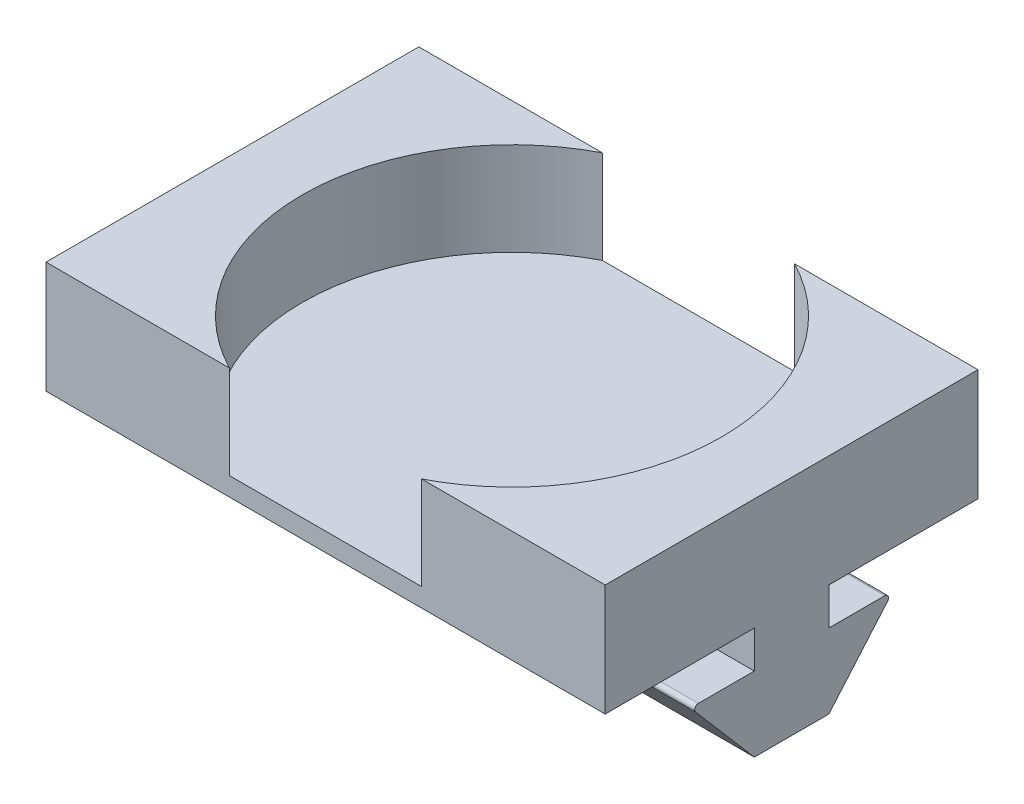
ISO-10303-21;
HEADER;
FILE_DESCRIPTION(('STEP AP214'),'2;1');
FILE_NAME('part.step','',(''),(''),'','','');
FILE_SCHEMA(('AUTOMOTIVE_DESIGN { 1 0 10303 214 1 1 1 1 }'));
ENDSEC;
DATA;
#1=APPLICATION_CONTEXT('core data for automotive mechanical design processes');
#2=APPLICATION_PROTOCOL_DEFINITION('international standard','automotive_design',2000,#1);
#3=PRODUCT_CONTEXT('',#1,'mechanical');
#4=PRODUCT('Part','Part','',(#3));
#5=PRODUCT_RELATED_PRODUCT_CATEGORY('part','',(#4));
#6=PRODUCT_DEFINITION_FORMATION('','',#4);
#7=PRODUCT_DEFINITION_CONTEXT('part definition',#1,'design');
#8=PRODUCT_DEFINITION('design','',#6,#7);
#9=PRODUCT_DEFINITION_SHAPE('','',#8);
#10=(LENGTH_UNIT() NAMED_UNIT(*) SI_UNIT(.MILLI.,.METRE.));
#11=(NAMED_UNIT(*) PLANE_ANGLE_UNIT() SI_UNIT($,.RADIAN.));
#12=(NAMED_UNIT(*) SI_UNIT($,.STERADIAN.) SOLID_ANGLE_UNIT());
#13=UNCERTAINTY_MEASURE_WITH_UNIT(LENGTH_MEASURE(1.E-05),#10,'distance_accuracy_value','');
#14=(GEOMETRIC_REPRESENTATION_CONTEXT(3) GLOBAL_UNCERTAINTY_ASSIGNED_CONTEXT((#13)) GLOBAL_UNIT_ASSIGNED_CONTEXT((#10,
#11,#12)) REPRESENTATION_CONTEXT('',''));
#15=CARTESIAN_POINT('',(0.,0.,0.));
#16=DIRECTION('',(0.,0.,1.));
#17=DIRECTION('',(1.,0.,0.));
#18=AXIS2_PLACEMENT_3D('',#15,#16,#17);
#19=CARTESIAN_POINT('',(0.,20.32,0.));
#20=DIRECTION('',(0.,1.,0.));
#21=DIRECTION('',(0.,0.,1.));
#22=AXIS2_PLACEMENT_3D('',#19,#20,#21);
#23=PLANE('',#22);
#24=CARTESIAN_POINT('',(-19.05,20.32,0.));
#25=DIRECTION('',(0.,1.,0.));
#26=DIRECTION('',(0.,0.,1.));
#27=AXIS2_PLACEMENT_3D('',#24,#25,#26);
#28=CIRCLE('',#27,14.2875);
#29=CARTESIAN_POINT('',(-12.504569819332,20.32,12.7));
#30=VERTEX_POINT('',#29);
#31=CARTESIAN_POINT('',(-12.504569819332,20.32,-12.7));
#32=VERTEX_POINT('',#31);
#33=EDGE_CURVE('E393',#30,#32,#28,.T.);
#34=ORIENTED_EDGE('',*,*,#33,.F.);
#35=DIRECTION('',(1.,0.,0.));
#36=VECTOR('',#35,1.);
#37=CARTESIAN_POINT('',(-38.1,20.32,12.7));
#38=LINE('',#37,#36);
#39=CARTESIAN_POINT('',(0.,20.32,12.7));
#40=VERTEX_POINT('',#39);
#41=EDGE_CURVE('E257',#30,#40,#38,.T.);
#42=ORIENTED_EDGE('',*,*,#41,.T.);
#43=DIRECTION('',(0.,0.,-1.));
#44=VECTOR('',#43,1.);
#45=CARTESIAN_POINT('',(0.,20.32,12.7));
#46=LINE('',#45,#44);
#47=CARTESIAN_POINT('',(0.,20.32,-12.7));
#48=VERTEX_POINT('',#47);
#49=EDGE_CURVE('E256',#40,#48,#46,.T.);
#50=ORIENTED_EDGE('',*,*,#49,.T.);
#51=DIRECTION('',(-1.,0.,0.));
#52=VECTOR('',#51,1.);
#53=CARTESIAN_POINT('',(-38.1,20.32,-12.7));
#54=LINE('',#53,#52);
#55=EDGE_CURVE('E400',#48,#32,#54,.T.);
#56=ORIENTED_EDGE('',*,*,#55,.T.);
#57=EDGE_LOOP('',(#34,#42,#50,#56));
#58=FACE_BOUND('',#57,.T.);
#59=ADVANCED_FACE('F43',(#58),#23,.T.);
#60=CARTESIAN_POINT('',(-38.1,0.,2.54));
#61=DIRECTION('',(0.,0.,1.));
#62=DIRECTION('',(1.,0.,0.));
#63=AXIS2_PLACEMENT_3D('',#60,#61,#62);
#64=PLANE('',#63);
#65=DIRECTION('',(0.,-1.,0.));
#66=VECTOR('',#65,1.);
#67=CARTESIAN_POINT('',(0.,0.,2.54));
#68=LINE('',#67,#66);
#69=CARTESIAN_POINT('',(0.,12.7,2.54));
#70=VERTEX_POINT('',#69);
#71=CARTESIAN_POINT('',(0.,10.16,2.54));
#72=VERTEX_POINT('',#71);
#73=EDGE_CURVE('E167',#70,#72,#68,.T.);
#74=ORIENTED_EDGE('',*,*,#73,.F.);
#75=DIRECTION('',(1.,0.,0.));
#76=VECTOR('',#75,1.);
#77=CARTESIAN_POINT('',(-38.1,12.7,2.54));
#78=LINE('',#77,#76);
#79=CARTESIAN_POINT('',(-38.1,12.7,2.54));
#80=VERTEX_POINT('',#79);
#81=EDGE_CURVE('E68',#80,#70,#78,.T.);
#82=ORIENTED_EDGE('',*,*,#81,.F.);
#83=DIRECTION('',(0.,-1.,0.));
#84=VECTOR('',#83,1.);
#85=CARTESIAN_POINT('',(-38.1,0.,2.54));
#86=LINE('',#85,#84);
#87=CARTESIAN_POINT('',(-38.1,10.16,2.54));
#88=VERTEX_POINT('',#87);
#89=EDGE_CURVE('E199',#80,#88,#86,.T.);
#90=ORIENTED_EDGE('',*,*,#89,.T.);
#91=DIRECTION('',(1.,0.,0.));
#92=VECTOR('',#91,1.);
#93=CARTESIAN_POINT('',(-38.1,10.16,2.54));
#94=LINE('',#93,#92);
#95=EDGE_CURVE('E113',#88,#72,#94,.T.);
#96=ORIENTED_EDGE('',*,*,#95,.T.);
#97=EDGE_LOOP('',(#74,#82,#90,#96));
#98=FACE_BOUND('',#97,.T.);
#99=ADVANCED_FACE('F45',(#98),#64,.T.);
#100=CARTESIAN_POINT('',(-38.1,0.,-2.54000000000001));
#101=DIRECTION('',(0.,0.,-1.));
#102=DIRECTION('',(0.,1.,0.));
#103=AXIS2_PLACEMENT_3D('',#100,#101,#102);
#104=PLANE('',#103);
#105=DIRECTION('',(0.,1.,0.));
#106=VECTOR('',#105,1.);
#107=CARTESIAN_POINT('',(0.,0.,-2.54000000000001));
#108=LINE('',#107,#106);
#109=CARTESIAN_POINT('',(0.,10.16,-2.54));
#110=VERTEX_POINT('',#109);
#111=CARTESIAN_POINT('',(0.,12.7,-2.54));
#112=VERTEX_POINT('',#111);
#113=EDGE_CURVE('E139',#110,#112,#108,.T.);
#114=ORIENTED_EDGE('',*,*,#113,.F.);
#115=DIRECTION('',(1.,0.,0.));
#116=VECTOR('',#115,1.);
#117=CARTESIAN_POINT('',(-38.1,10.16,-2.54));
#118=LINE('',#117,#116);
#119=CARTESIAN_POINT('',(-38.1,10.16,-2.54));
#120=VERTEX_POINT('',#119);
#121=EDGE_CURVE('E135',#120,#110,#118,.T.);
#122=ORIENTED_EDGE('',*,*,#121,.F.);
#123=DIRECTION('',(0.,1.,0.));
#124=VECTOR('',#123,1.);
#125=CARTESIAN_POINT('',(-38.1,0.,-2.54000000000001));
#126=LINE('',#125,#124);
#127=CARTESIAN_POINT('',(-38.1,12.7,-2.54));
#128=VERTEX_POINT('',#127);
#129=EDGE_CURVE('E138',#120,#128,#126,.T.);
#130=ORIENTED_EDGE('',*,*,#129,.T.);
#131=DIRECTION('',(1.,0.,0.));
#132=VECTOR('',#131,1.);
#133=CARTESIAN_POINT('',(-38.1,12.7,-2.54));
#134=LINE('',#133,#132);
#135=EDGE_CURVE('E105',#128,#112,#134,.T.);
#136=ORIENTED_EDGE('',*,*,#135,.T.);
#137=EDGE_LOOP('',(#114,#122,#130,#136));
#138=FACE_BOUND('',#137,.T.);
#139=ADVANCED_FACE('F137',(#138),#104,.T.);
#140=CARTESIAN_POINT('',(-38.1,10.16,0.));
#141=DIRECTION('',(0.,1.,0.));
#142=DIRECTION('',(0.,0.,1.));
#143=AXIS2_PLACEMENT_3D('',#140,#141,#142);
#144=PLANE('',#143);
#145=DIRECTION('',(0.,0.,1.));
#146=VECTOR('',#145,1.);
#147=CARTESIAN_POINT('',(0.,10.16,0.));
#148=LINE('',#147,#146);
#149=CARTESIAN_POINT('',(0.,10.16,-6.35));
#150=VERTEX_POINT('',#149);
#151=EDGE_CURVE('E194',#150,#110,#148,.T.);
#152=ORIENTED_EDGE('',*,*,#151,.F.);
#153=DIRECTION('',(1.,0.,0.));
#154=VECTOR('',#153,1.);
#155=CARTESIAN_POINT('',(-38.1,10.16,-6.35));
#156=LINE('',#155,#154);
#157=CARTESIAN_POINT('',(-38.1,10.16,-6.35));
#158=VERTEX_POINT('',#157);
#159=EDGE_CURVE('E145',#158,#150,#156,.T.);
#160=ORIENTED_EDGE('',*,*,#159,.F.);
#161=DIRECTION('',(0.,0.,1.));
#162=VECTOR('',#161,1.);
#163=CARTESIAN_POINT('',(-38.1,10.16,0.));
#164=LINE('',#163,#162);
#165=EDGE_CURVE('E151',#158,#120,#164,.T.);
#166=ORIENTED_EDGE('',*,*,#165,.T.);
#167=ORIENTED_EDGE('',*,*,#121,.T.);
#168=EDGE_LOOP('',(#152,#160,#166,#167));
#169=FACE_BOUND('',#168,.T.);
#170=ADVANCED_FACE('F157',(#169),#144,.T.);
#171=CARTESIAN_POINT('',(-38.1,9.906,-6.35));
#172=DIRECTION('',(1.,0.,0.));
#173=DIRECTION('',(0.,0.,-1.));
#174=AXIS2_PLACEMENT_3D('',#171,#172,#173);
#175=CYLINDRICAL_SURFACE('',#174,0.254000000000001);
#176=CARTESIAN_POINT('',(0.,9.906,-6.35));
#177=DIRECTION('',(1.,0.,0.));
#178=DIRECTION('',(0.,0.,-1.));
#179=AXIS2_PLACEMENT_3D('',#176,#177,#178);
#180=CIRCLE('',#179,0.254000000000001);
#181=CARTESIAN_POINT('',(0.,9.74050920467056,-6.54268834075063));
#182=VERTEX_POINT('',#181);
#183=EDGE_CURVE('E191',#150,#182,#180,.F.);
#184=ORIENTED_EDGE('',*,*,#183,.T.);
#185=DIRECTION('',(1.,0.,0.));
#186=VECTOR('',#185,1.);
#187=CARTESIAN_POINT('',(-38.1,9.74050920467056,-6.54268834075063));
#188=LINE('',#187,#186);
#189=CARTESIAN_POINT('',(-38.1,9.74050920467056,-6.54268834075063));
#190=VERTEX_POINT('',#189);
#191=EDGE_CURVE('E206',#190,#182,#188,.T.);
#192=ORIENTED_EDGE('',*,*,#191,.F.);
#193=CARTESIAN_POINT('',(-38.1,9.906,-6.35));
#194=DIRECTION('',(1.,0.,0.));
#195=DIRECTION('',(0.,0.,-1.));
#196=AXIS2_PLACEMENT_3D('',#193,#194,#195);
#197=CIRCLE('',#196,0.254000000000001);
#198=EDGE_CURVE('E160',#158,#190,#197,.F.);
#199=ORIENTED_EDGE('',*,*,#198,.F.);
#200=ORIENTED_EDGE('',*,*,#159,.T.);
#201=EDGE_LOOP('',(#184,#192,#199,#200));
#202=FACE_BOUND('',#201,.T.);
#203=ADVANCED_FACE('F556',(#202),#175,.T.);
#204=CARTESIAN_POINT('',(-38.1,0.90103385496104,1.04911404967848));
#205=DIRECTION('',(0.,0.651538564289137,0.758615514766241));
#206=DIRECTION('',(0.,-0.758615514766242,0.651538564289137));
#207=AXIS2_PLACEMENT_3D('',#204,#205,#206);
#208=PLANE('',#207);
#209=DIRECTION('',(0.,-0.758615514766242,0.651538564289137));
#210=VECTOR('',#209,1.);
#211=CARTESIAN_POINT('',(0.,0.90103385496104,1.04911404967848));
#212=LINE('',#211,#210);
#213=CARTESIAN_POINT('',(0.,5.08,-2.54));
#214=VERTEX_POINT('',#213);
#215=EDGE_CURVE('E188',#182,#214,#212,.T.);
#216=ORIENTED_EDGE('',*,*,#215,.T.);
#217=DIRECTION('',(1.,0.,0.));
#218=VECTOR('',#217,1.);
#219=CARTESIAN_POINT('',(-38.1,5.08,-2.54));
#220=LINE('',#219,#218);
#221=CARTESIAN_POINT('',(-38.1,5.08,-2.54));
#222=VERTEX_POINT('',#221);
#223=EDGE_CURVE('E210',#222,#214,#220,.T.);
#224=ORIENTED_EDGE('',*,*,#223,.F.);
#225=DIRECTION('',(0.,-0.758615514766242,0.651538564289137));
#226=VECTOR('',#225,1.);
#227=CARTESIAN_POINT('',(-38.1,0.90103385496104,1.04911404967848));
#228=LINE('',#227,#226);
#229=EDGE_CURVE('E163',#190,#222,#228,.T.);
#230=ORIENTED_EDGE('',*,*,#229,.F.);
#231=ORIENTED_EDGE('',*,*,#191,.T.);
#232=EDGE_LOOP('',(#216,#224,#230,#231));
#233=FACE_BOUND('',#232,.T.);
#234=ADVANCED_FACE('F321',(#233),#208,.F.);
#235=CARTESIAN_POINT('',(-38.1,5.08,0.));
#236=DIRECTION('',(0.,1.,0.));
#237=DIRECTION('',(0.,0.,1.));
#238=AXIS2_PLACEMENT_3D('',#235,#236,#237);
#239=PLANE('',#238);
#240=DIRECTION('',(0.,0.,1.));
#241=VECTOR('',#240,1.);
#242=CARTESIAN_POINT('',(0.,5.08,0.));
#243=LINE('',#242,#241);
#244=CARTESIAN_POINT('',(0.,5.08,2.54));
#245=VERTEX_POINT('',#244);
#246=EDGE_CURVE('E184',#214,#245,#243,.T.);
#247=ORIENTED_EDGE('',*,*,#246,.T.);
#248=DIRECTION('',(1.,0.,0.));
#249=VECTOR('',#248,1.);
#250=CARTESIAN_POINT('',(-38.1,5.08,2.54));
#251=LINE('',#250,#249);
#252=CARTESIAN_POINT('',(-38.1,5.08,2.54));
#253=VERTEX_POINT('',#252);
#254=EDGE_CURVE('E214',#253,#245,#251,.T.);
#255=ORIENTED_EDGE('',*,*,#254,.F.);
#256=DIRECTION('',(0.,0.,1.));
#257=VECTOR('',#256,1.);
#258=CARTESIAN_POINT('',(-38.1,5.08,0.));
#259=LINE('',#258,#257);
#260=EDGE_CURVE('E311',#222,#253,#259,.T.);
#261=ORIENTED_EDGE('',*,*,#260,.F.);
#262=ORIENTED_EDGE('',*,*,#223,.T.);
#263=EDGE_LOOP('',(#247,#255,#261,#262));
#264=FACE_BOUND('',#263,.T.);
#265=ADVANCED_FACE('F325',(#264),#239,.F.);
#266=CARTESIAN_POINT('',(-38.1,0.90103385496104,-1.04911404967848));
#267=DIRECTION('',(0.,-0.651538564289137,0.758615514766241));
#268=DIRECTION('',(0.,-0.758615514766242,-0.651538564289137));
#269=AXIS2_PLACEMENT_3D('',#266,#267,#268);
#270=PLANE('',#269);
#271=DIRECTION('',(0.,-0.758615514766242,-0.651538564289137));
#272=VECTOR('',#271,1.);
#273=CARTESIAN_POINT('',(0.,0.90103385496104,-1.04911404967848));
#274=LINE('',#273,#272);
#275=CARTESIAN_POINT('',(0.,9.74050920467056,6.54268834075063));
#276=VERTEX_POINT('',#275);
#277=EDGE_CURVE('E180',#276,#245,#274,.T.);
#278=ORIENTED_EDGE('',*,*,#277,.F.);
#279=DIRECTION('',(1.,0.,0.));
#280=VECTOR('',#279,1.);
#281=CARTESIAN_POINT('',(-38.1,9.74050920467056,6.54268834075063));
#282=LINE('',#281,#280);
#283=CARTESIAN_POINT('',(-38.1,9.74050920467056,6.54268834075063));
#284=VERTEX_POINT('',#283);
#285=EDGE_CURVE('E217',#284,#276,#282,.T.);
#286=ORIENTED_EDGE('',*,*,#285,.F.);
#287=DIRECTION('',(0.,-0.758615514766242,-0.651538564289137));
#288=VECTOR('',#287,1.);
#289=CARTESIAN_POINT('',(-38.1,0.90103385496104,-1.04911404967848));
#290=LINE('',#289,#288);
#291=EDGE_CURVE('E307',#284,#253,#290,.T.);
#292=ORIENTED_EDGE('',*,*,#291,.T.);
#293=ORIENTED_EDGE('',*,*,#254,.T.);
#294=EDGE_LOOP('',(#278,#286,#292,#293));
#295=FACE_BOUND('',#294,.T.);
#296=ADVANCED_FACE('F328',(#295),#270,.T.);
#297=CARTESIAN_POINT('',(-38.1,9.906,6.35));
#298=DIRECTION('',(1.,0.,0.));
#299=DIRECTION('',(0.,0.,-1.));
#300=AXIS2_PLACEMENT_3D('',#297,#298,#299);
#301=CYLINDRICAL_SURFACE('',#300,0.254);
#302=CARTESIAN_POINT('',(0.,9.906,6.35));
#303=DIRECTION('',(1.,0.,0.));
#304=DIRECTION('',(0.,0.,-1.));
#305=AXIS2_PLACEMENT_3D('',#302,#303,#304);
#306=CIRCLE('',#305,0.254);
#307=CARTESIAN_POINT('',(0.,10.16,6.35));
#308=VERTEX_POINT('',#307);
#309=EDGE_CURVE('E176',#308,#276,#306,.T.);
#310=ORIENTED_EDGE('',*,*,#309,.F.);
#311=DIRECTION('',(1.,0.,0.));
#312=VECTOR('',#311,1.);
#313=CARTESIAN_POINT('',(-38.1,10.16,6.35));
#314=LINE('',#313,#312);
#315=CARTESIAN_POINT('',(-38.1,10.16,6.35));
#316=VERTEX_POINT('',#315);
#317=EDGE_CURVE('E220',#316,#308,#314,.T.);
#318=ORIENTED_EDGE('',*,*,#317,.F.);
#319=CARTESIAN_POINT('',(-38.1,9.906,6.35));
#320=DIRECTION('',(1.,0.,0.));
#321=DIRECTION('',(0.,0.,-1.));
#322=AXIS2_PLACEMENT_3D('',#319,#320,#321);
#323=CIRCLE('',#322,0.254);
#324=EDGE_CURVE('E303',#316,#284,#323,.T.);
#325=ORIENTED_EDGE('',*,*,#324,.T.);
#326=ORIENTED_EDGE('',*,*,#285,.T.);
#327=EDGE_LOOP('',(#310,#318,#325,#326));
#328=FACE_BOUND('',#327,.T.);
#329=ADVANCED_FACE('F332',(#328),#301,.T.);
#330=CARTESIAN_POINT('',(-38.1,10.16,0.));
#331=DIRECTION('',(0.,1.,0.));
#332=DIRECTION('',(0.,0.,1.));
#333=AXIS2_PLACEMENT_3D('',#330,#331,#332);
#334=PLANE('',#333);
#335=DIRECTION('',(0.,0.,1.));
#336=VECTOR('',#335,1.);
#337=CARTESIAN_POINT('',(0.,10.16,0.));
#338=LINE('',#337,#336);
#339=EDGE_CURVE('E171',#72,#308,#338,.T.);
#340=ORIENTED_EDGE('',*,*,#339,.F.);
#341=ORIENTED_EDGE('',*,*,#95,.F.);
#342=DIRECTION('',(0.,0.,1.));
#343=VECTOR('',#342,1.);
#344=CARTESIAN_POINT('',(-38.1,10.16,0.));
#345=LINE('',#344,#343);
#346=EDGE_CURVE('E300',#88,#316,#345,.T.);
#347=ORIENTED_EDGE('',*,*,#346,.T.);
#348=ORIENTED_EDGE('',*,*,#317,.T.);
#349=EDGE_LOOP('',(#340,#341,#347,#348));
#350=FACE_BOUND('',#349,.T.);
#351=ADVANCED_FACE('F333',(#350),#334,.T.);
#352=CARTESIAN_POINT('',(-38.1,0.,0.));
#353=DIRECTION('',(1.,0.,0.));
#354=DIRECTION('',(0.,0.,-1.));
#355=AXIS2_PLACEMENT_3D('',#352,#353,#354);
#356=PLANE('',#355);
#357=ORIENTED_EDGE('',*,*,#89,.F.);
#358=DIRECTION('',(0.,0.,1.));
#359=VECTOR('',#358,1.);
#360=CARTESIAN_POINT('',(-38.1,12.7,12.7));
#361=LINE('',#360,#359);
#362=CARTESIAN_POINT('',(-38.1,12.7,12.7));
#363=VERTEX_POINT('',#362);
#364=EDGE_CURVE('E272',#80,#363,#361,.T.);
#365=ORIENTED_EDGE('',*,*,#364,.T.);
#366=DIRECTION('',(0.,-1.,0.));
#367=VECTOR('',#366,1.);
#368=CARTESIAN_POINT('',(-38.1,20.32,12.7));
#369=LINE('',#368,#367);
#370=CARTESIAN_POINT('',(-38.1,20.32,12.7));
#371=VERTEX_POINT('',#370);
#372=EDGE_CURVE('E293',#371,#363,#369,.T.);
#373=ORIENTED_EDGE('',*,*,#372,.F.);
#374=DIRECTION('',(0.,0.,1.));
#375=VECTOR('',#374,1.);
#376=CARTESIAN_POINT('',(-38.1,20.32,12.7));
#377=LINE('',#376,#375);
#378=CARTESIAN_POINT('',(-38.1,20.32,-12.7));
#379=VERTEX_POINT('',#378);
#380=EDGE_CURVE('E253',#379,#371,#377,.T.);
#381=ORIENTED_EDGE('',*,*,#380,.F.);
#382=DIRECTION('',(0.,-1.,0.));
#383=VECTOR('',#382,1.);
#384=CARTESIAN_POINT('',(-38.1,20.32,-12.7));
#385=LINE('',#384,#383);
#386=CARTESIAN_POINT('',(-38.1,12.7,-12.7));
#387=VERTEX_POINT('',#386);
#388=EDGE_CURVE('E172',#379,#387,#385,.T.);
#389=ORIENTED_EDGE('',*,*,#388,.T.);
#390=EDGE_CURVE('E154',#387,#128,#361,.T.);
#391=ORIENTED_EDGE('',*,*,#390,.T.);
#392=ORIENTED_EDGE('',*,*,#129,.F.);
#393=ORIENTED_EDGE('',*,*,#165,.F.);
#394=ORIENTED_EDGE('',*,*,#198,.T.);
#395=ORIENTED_EDGE('',*,*,#229,.T.);
#396=ORIENTED_EDGE('',*,*,#260,.T.);
#397=ORIENTED_EDGE('',*,*,#291,.F.);
#398=ORIENTED_EDGE('',*,*,#324,.F.);
#399=ORIENTED_EDGE('',*,*,#346,.F.);
#400=EDGE_LOOP('',(#357,#365,#373,#381,#389,#391,#392,#393,#394,#395,#396,#397,#398,#399));
#401=FACE_BOUND('',#400,.T.);
#402=ADVANCED_FACE('F150',(#401),#356,.F.);
#403=CARTESIAN_POINT('',(0.,0.,0.));
#404=DIRECTION('',(1.,0.,0.));
#405=DIRECTION('',(0.,0.,-1.));
#406=AXIS2_PLACEMENT_3D('',#403,#404,#405);
#407=PLANE('',#406);
#408=ORIENTED_EDGE('',*,*,#73,.T.);
#409=ORIENTED_EDGE('',*,*,#339,.T.);
#410=ORIENTED_EDGE('',*,*,#309,.T.);
#411=ORIENTED_EDGE('',*,*,#277,.T.);
#412=ORIENTED_EDGE('',*,*,#246,.F.);
#413=ORIENTED_EDGE('',*,*,#215,.F.);
#414=ORIENTED_EDGE('',*,*,#183,.F.);
#415=ORIENTED_EDGE('',*,*,#151,.T.);
#416=ORIENTED_EDGE('',*,*,#113,.T.);
#417=DIRECTION('',(0.,0.,-1.));
#418=VECTOR('',#417,1.);
#419=CARTESIAN_POINT('',(0.,12.7,12.7));
#420=LINE('',#419,#418);
#421=CARTESIAN_POINT('',(0.,12.7,-12.7));
#422=VERTEX_POINT('',#421);
#423=EDGE_CURVE('E280',#112,#422,#420,.T.);
#424=ORIENTED_EDGE('',*,*,#423,.T.);
#425=DIRECTION('',(0.,-1.,0.));
#426=VECTOR('',#425,1.);
#427=CARTESIAN_POINT('',(0.,20.32,-12.7));
#428=LINE('',#427,#426);
#429=EDGE_CURVE('E262',#48,#422,#428,.T.);
#430=ORIENTED_EDGE('',*,*,#429,.F.);
#431=ORIENTED_EDGE('',*,*,#49,.F.);
#432=DIRECTION('',(0.,-1.,0.));
#433=VECTOR('',#432,1.);
#434=CARTESIAN_POINT('',(0.,20.32,12.7));
#435=LINE('',#434,#433);
#436=CARTESIAN_POINT('',(0.,12.7,12.7));
#437=VERTEX_POINT('',#436);
#438=EDGE_CURVE('E289',#40,#437,#435,.T.);
#439=ORIENTED_EDGE('',*,*,#438,.T.);
#440=EDGE_CURVE('E281',#437,#70,#420,.T.);
#441=ORIENTED_EDGE('',*,*,#440,.T.);
#442=EDGE_LOOP('',(#408,#409,#410,#411,#412,#413,#414,#415,#416,#424,#430,#431,#439,#441));
#443=FACE_BOUND('',#442,.T.);
#444=ADVANCED_FACE('F343',(#443),#407,.T.);
#445=CARTESIAN_POINT('',(0.,12.7,0.));
#446=DIRECTION('',(0.,1.,0.));
#447=DIRECTION('',(0.,0.,1.));
#448=AXIS2_PLACEMENT_3D('',#445,#446,#447);
#449=PLANE('',#448);
#450=ORIENTED_EDGE('',*,*,#364,.F.);
#451=ORIENTED_EDGE('',*,*,#81,.T.);
#452=ORIENTED_EDGE('',*,*,#440,.F.);
#453=DIRECTION('',(1.,0.,0.));
#454=VECTOR('',#453,1.);
#455=CARTESIAN_POINT('',(-38.1,12.7,12.7));
#456=LINE('',#455,#454);
#457=EDGE_CURVE('E276',#363,#437,#456,.T.);
#458=ORIENTED_EDGE('',*,*,#457,.F.);
#459=EDGE_LOOP('',(#450,#451,#452,#458));
#460=FACE_BOUND('',#459,.T.);
#461=ADVANCED_FACE('F340',(#460),#449,.F.);
#462=CARTESIAN_POINT('',(-38.1,20.32,-12.7));
#463=DIRECTION('',(0.,0.,1.));
#464=DIRECTION('',(1.,0.,0.));
#465=AXIS2_PLACEMENT_3D('',#462,#463,#464);
#466=PLANE('',#465);
#467=DIRECTION('',(-1.,0.,0.));
#468=VECTOR('',#467,1.);
#469=CARTESIAN_POINT('',(-38.1,13.97,-12.7));
#470=LINE('',#469,#468);
#471=CARTESIAN_POINT('',(-12.504569819332,13.97,-12.7));
#472=VERTEX_POINT('',#471);
#473=CARTESIAN_POINT('',(-25.595430180668,13.97,-12.7));
#474=VERTEX_POINT('',#473);
#475=EDGE_CURVE('E273',#472,#474,#470,.T.);
#476=ORIENTED_EDGE('',*,*,#475,.F.);
#477=DIRECTION('',(0.,1.,0.));
#478=VECTOR('',#477,1.);
#479=CARTESIAN_POINT('',(-12.504569819332,13.97,-12.7));
#480=LINE('',#479,#478);
#481=EDGE_CURVE('E387',#472,#32,#480,.T.);
#482=ORIENTED_EDGE('',*,*,#481,.T.);
#483=ORIENTED_EDGE('',*,*,#55,.F.);
#484=ORIENTED_EDGE('',*,*,#429,.T.);
#485=DIRECTION('',(-1.,0.,0.));
#486=VECTOR('',#485,1.);
#487=CARTESIAN_POINT('',(-38.1,12.7,-12.7));
#488=LINE('',#487,#486);
#489=EDGE_CURVE('E268',#422,#387,#488,.T.);
#490=ORIENTED_EDGE('',*,*,#489,.T.);
#491=ORIENTED_EDGE('',*,*,#388,.F.);
#492=CARTESIAN_POINT('',(-25.595430180668,20.32,-12.7));
#493=VERTEX_POINT('',#492);
#494=EDGE_CURVE('E285',#493,#379,#54,.T.);
#495=ORIENTED_EDGE('',*,*,#494,.F.);
#496=DIRECTION('',(0.,1.,0.));
#497=VECTOR('',#496,1.);
#498=CARTESIAN_POINT('',(-25.595430180668,13.97,-12.7));
#499=LINE('',#498,#497);
#500=EDGE_CURVE('E59',#493,#474,#499,.F.);
#501=ORIENTED_EDGE('',*,*,#500,.T.);
#502=EDGE_LOOP('',(#476,#482,#483,#484,#490,#491,#495,#501));
#503=FACE_BOUND('',#502,.T.);
#504=ADVANCED_FACE('F410',(#503),#466,.F.);
#505=CARTESIAN_POINT('',(-38.1,20.32,12.7));
#506=DIRECTION('',(0.,0.,-1.));
#507=DIRECTION('',(0.,1.,0.));
#508=AXIS2_PLACEMENT_3D('',#505,#506,#507);
#509=PLANE('',#508);
#510=DIRECTION('',(1.,0.,0.));
#511=VECTOR('',#510,1.);
#512=CARTESIAN_POINT('',(-38.1,13.97,12.7));
#513=LINE('',#512,#511);
#514=CARTESIAN_POINT('',(-25.595430180668,13.97,12.7));
#515=VERTEX_POINT('',#514);
#516=CARTESIAN_POINT('',(-12.504569819332,13.97,12.7));
#517=VERTEX_POINT('',#516);
#518=EDGE_CURVE('E11',#515,#517,#513,.T.);
#519=ORIENTED_EDGE('',*,*,#518,.F.);
#520=DIRECTION('',(0.,1.,0.));
#521=VECTOR('',#520,1.);
#522=CARTESIAN_POINT('',(-25.595430180668,13.97,12.7));
#523=LINE('',#522,#521);
#524=CARTESIAN_POINT('',(-25.595430180668,20.32,12.7));
#525=VERTEX_POINT('',#524);
#526=EDGE_CURVE('E230',#515,#525,#523,.T.);
#527=ORIENTED_EDGE('',*,*,#526,.T.);
#528=EDGE_CURVE('E245',#371,#525,#38,.T.);
#529=ORIENTED_EDGE('',*,*,#528,.F.);
#530=ORIENTED_EDGE('',*,*,#372,.T.);
#531=ORIENTED_EDGE('',*,*,#457,.T.);
#532=ORIENTED_EDGE('',*,*,#438,.F.);
#533=ORIENTED_EDGE('',*,*,#41,.F.);
#534=DIRECTION('',(0.,1.,0.));
#535=VECTOR('',#534,1.);
#536=CARTESIAN_POINT('',(-12.504569819332,13.97,12.7));
#537=LINE('',#536,#535);
#538=EDGE_CURVE('E248',#30,#517,#537,.F.);
#539=ORIENTED_EDGE('',*,*,#538,.T.);
#540=EDGE_LOOP('',(#519,#527,#529,#530,#531,#532,#533,#539));
#541=FACE_BOUND('',#540,.T.);
#542=ADVANCED_FACE('F242',(#541),#509,.F.);
#543=CARTESIAN_POINT('',(-19.05,20.32,0.));
#544=DIRECTION('',(0.,1.,0.));
#545=DIRECTION('',(0.,0.,1.));
#546=AXIS2_PLACEMENT_3D('',#543,#544,#545);
#547=CIRCLE('',#546,14.2875);
#548=EDGE_CURVE('E52',#493,#525,#547,.T.);
#549=ORIENTED_EDGE('',*,*,#548,.F.);
#550=ORIENTED_EDGE('',*,*,#494,.T.);
#551=ORIENTED_EDGE('',*,*,#380,.T.);
#552=ORIENTED_EDGE('',*,*,#528,.T.);
#553=EDGE_LOOP('',(#549,#550,#551,#552));
#554=FACE_BOUND('',#553,.T.);
#555=ADVANCED_FACE('F251',(#554),#23,.T.);
#556=ORIENTED_EDGE('',*,*,#135,.F.);
#557=ORIENTED_EDGE('',*,*,#390,.F.);
#558=ORIENTED_EDGE('',*,*,#489,.F.);
#559=ORIENTED_EDGE('',*,*,#423,.F.);
#560=EDGE_LOOP('',(#556,#557,#558,#559));
#561=FACE_BOUND('',#560,.T.);
#562=ADVANCED_FACE('F413',(#561),#449,.F.);
#563=CARTESIAN_POINT('',(-19.05,13.97,0.));
#564=DIRECTION('',(0.,1.,0.));
#565=DIRECTION('',(0.,0.,1.));
#566=AXIS2_PLACEMENT_3D('',#563,#564,#565);
#567=PLANE('',#566);
#568=ORIENTED_EDGE('',*,*,#475,.T.);
#569=CARTESIAN_POINT('',(-19.05,13.97,0.));
#570=DIRECTION('',(0.,1.,0.));
#571=DIRECTION('',(0.,0.,1.));
#572=AXIS2_PLACEMENT_3D('',#569,#570,#571);
#573=CIRCLE('',#572,14.2875);
#574=EDGE_CURVE('E383',#474,#515,#573,.T.);
#575=ORIENTED_EDGE('',*,*,#574,.T.);
#576=ORIENTED_EDGE('',*,*,#518,.T.);
#577=EDGE_CURVE('E381',#517,#472,#573,.T.);
#578=ORIENTED_EDGE('',*,*,#577,.T.);
#579=EDGE_LOOP('',(#568,#575,#576,#578));
#580=FACE_BOUND('',#579,.T.);
#581=ADVANCED_FACE('F380',(#580),#567,.T.);
#582=CARTESIAN_POINT('',(-19.05,13.97,0.));
#583=DIRECTION('',(0.,1.,0.));
#584=DIRECTION('',(0.,0.,1.));
#585=AXIS2_PLACEMENT_3D('',#582,#583,#584);
#586=CYLINDRICAL_SURFACE('',#585,14.2875);
#587=ORIENTED_EDGE('',*,*,#577,.F.);
#588=ORIENTED_EDGE('',*,*,#538,.F.);
#589=ORIENTED_EDGE('',*,*,#33,.T.);
#590=ORIENTED_EDGE('',*,*,#481,.F.);
#591=EDGE_LOOP('',(#587,#588,#589,#590));
#592=FACE_BOUND('',#591,.T.);
#593=ADVANCED_FACE('F385',(#592),#586,.F.);
#594=ORIENTED_EDGE('',*,*,#548,.T.);
#595=ORIENTED_EDGE('',*,*,#526,.F.);
#596=ORIENTED_EDGE('',*,*,#574,.F.);
#597=ORIENTED_EDGE('',*,*,#500,.F.);
#598=EDGE_LOOP('',(#594,#595,#596,#597));
#599=FACE_BOUND('',#598,.T.);
#600=ADVANCED_FACE('F228',(#599),#586,.F.);
#601=CLOSED_SHELL('',(#59,#99,#139,#170,#203,#234,#265,#296,#329,#351,#402,#444,#461,#504,#542,
#555,#562,#581,#593,#600));
#602=MANIFOLD_SOLID_BREP('B2',#601);
#603=ADVANCED_BREP_SHAPE_REPRESENTATION('',(#18,#602),#14);
#604=SHAPE_DEFINITION_REPRESENTATION(#9,#603);
ENDSEC;
END-ISO-10303-21;
